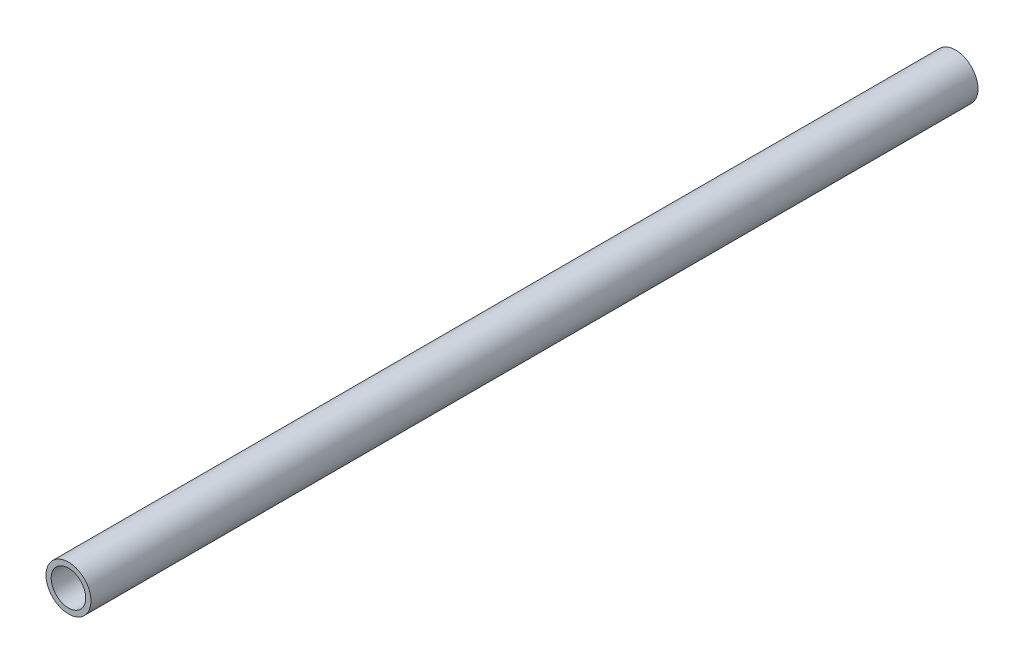
ISO-10303-21;
HEADER;
FILE_DESCRIPTION(('STEP AP214'),'2;1');
FILE_NAME('part.step','',(''),(''),'','','');
FILE_SCHEMA(('AUTOMOTIVE_DESIGN { 1 0 10303 214 1 1 1 1 }'));
ENDSEC;
DATA;
#1=APPLICATION_CONTEXT('core data for automotive mechanical design processes');
#2=APPLICATION_PROTOCOL_DEFINITION('international standard','automotive_design',2000,#1);
#3=PRODUCT_CONTEXT('',#1,'mechanical');
#4=PRODUCT('Part','Part','',(#3));
#5=PRODUCT_RELATED_PRODUCT_CATEGORY('part','',(#4));
#6=PRODUCT_DEFINITION_FORMATION('','',#4);
#7=PRODUCT_DEFINITION_CONTEXT('part definition',#1,'design');
#8=PRODUCT_DEFINITION('design','',#6,#7);
#9=PRODUCT_DEFINITION_SHAPE('','',#8);
#10=(LENGTH_UNIT() NAMED_UNIT(*) SI_UNIT(.MILLI.,.METRE.));
#11=(NAMED_UNIT(*) PLANE_ANGLE_UNIT() SI_UNIT($,.RADIAN.));
#12=(NAMED_UNIT(*) SI_UNIT($,.STERADIAN.) SOLID_ANGLE_UNIT());
#13=UNCERTAINTY_MEASURE_WITH_UNIT(LENGTH_MEASURE(1.E-05),#10,'distance_accuracy_value','');
#14=(GEOMETRIC_REPRESENTATION_CONTEXT(3) GLOBAL_UNCERTAINTY_ASSIGNED_CONTEXT((#13)) GLOBAL_UNIT_ASSIGNED_CONTEXT((#10,
#11,#12)) REPRESENTATION_CONTEXT('',''));
#15=CARTESIAN_POINT('',(0.,0.,0.));
#16=DIRECTION('',(0.,0.,1.));
#17=DIRECTION('',(1.,0.,0.));
#18=AXIS2_PLACEMENT_3D('',#15,#16,#17);
#19=CARTESIAN_POINT('',(0.,0.,0.));
#20=DIRECTION('',(0.,0.,1.));
#21=DIRECTION('',(1.,0.,0.));
#22=AXIS2_PLACEMENT_3D('',#19,#20,#21);
#23=PLANE('',#22);
#24=CARTESIAN_POINT('',(0.,0.,0.));
#25=DIRECTION('',(0.,0.,1.));
#26=DIRECTION('',(1.,0.,0.));
#27=AXIS2_PLACEMENT_3D('',#24,#25,#26);
#28=CIRCLE('',#27,6.35);
#29=CARTESIAN_POINT('',(6.35,0.,0.));
#30=VERTEX_POINT('',#29);
#31=EDGE_CURVE('E38',#30,#30,#28,.T.);
#32=ORIENTED_EDGE('',*,*,#31,.F.);
#33=EDGE_LOOP('',(#32));
#34=FACE_BOUND('',#33,.T.);
#35=CARTESIAN_POINT('',(0.,0.,0.));
#36=DIRECTION('',(0.,0.,1.));
#37=DIRECTION('',(1.,0.,0.));
#38=AXIS2_PLACEMENT_3D('',#35,#36,#37);
#39=CIRCLE('',#38,4.8768);
#40=CARTESIAN_POINT('',(4.8768,0.,0.));
#41=VERTEX_POINT('',#40);
#42=EDGE_CURVE('E51',#41,#41,#39,.T.);
#43=ORIENTED_EDGE('',*,*,#42,.T.);
#44=EDGE_LOOP('',(#43));
#45=FACE_BOUND('',#44,.T.);
#46=ADVANCED_FACE('F34',(#34,#45),#23,.F.);
#47=CARTESIAN_POINT('',(0.,0.,268.450232242138));
#48=DIRECTION('',(0.,0.,-1.));
#49=DIRECTION('',(-1.,0.,0.));
#50=AXIS2_PLACEMENT_3D('',#47,#48,#49);
#51=CYLINDRICAL_SURFACE('',#50,6.35);
#52=CARTESIAN_POINT('',(0.,0.,250.48972));
#53=DIRECTION('',(0.,0.,-1.));
#54=DIRECTION('',(-0.981498676058551,-0.19146892409817,0.));
#55=AXIS2_PLACEMENT_3D('',#52,#53,#54);
#56=CIRCLE('',#55,6.35);
#57=CARTESIAN_POINT('',(-6.23251659297183,-1.21582766802342,250.48972));
#58=VERTEX_POINT('',#57);
#59=EDGE_CURVE('E10',#58,#58,#56,.T.);
#60=ORIENTED_EDGE('',*,*,#59,.T.);
#61=EDGE_LOOP('',(#60));
#62=FACE_BOUND('',#61,.T.);
#63=ORIENTED_EDGE('',*,*,#31,.T.);
#64=EDGE_LOOP('',(#63));
#65=FACE_BOUND('',#64,.T.);
#66=ADVANCED_FACE('F36',(#62,#65),#51,.T.);
#67=CARTESIAN_POINT('',(0.,0.,268.450232242138));
#68=DIRECTION('',(0.,0.,-1.));
#69=DIRECTION('',(-1.,0.,0.));
#70=AXIS2_PLACEMENT_3D('',#67,#68,#69);
#71=CYLINDRICAL_SURFACE('',#70,4.8768);
#72=CARTESIAN_POINT('',(0.,0.,250.48972));
#73=DIRECTION('',(0.,0.,-1.));
#74=DIRECTION('',(-0.981498676058551,-0.19146892409817,0.));
#75=AXIS2_PLACEMENT_3D('',#72,#73,#74);
#76=CIRCLE('',#75,4.8768);
#77=CARTESIAN_POINT('',(-4.78657274340237,-0.933755649041999,250.48972));
#78=VERTEX_POINT('',#77);
#79=EDGE_CURVE('E43',#78,#78,#76,.T.);
#80=ORIENTED_EDGE('',*,*,#79,.F.);
#81=EDGE_LOOP('',(#80));
#82=FACE_BOUND('',#81,.T.);
#83=ORIENTED_EDGE('',*,*,#42,.F.);
#84=EDGE_LOOP('',(#83));
#85=FACE_BOUND('',#84,.T.);
#86=ADVANCED_FACE('F67',(#82,#85),#71,.F.);
#87=CARTESIAN_POINT('',(0.,0.,250.48972));
#88=DIRECTION('',(0.,0.,-1.));
#89=DIRECTION('',(-0.981498676058551,-0.19146892409817,0.));
#90=AXIS2_PLACEMENT_3D('',#87,#88,#89);
#91=PLANE('',#90);
#92=ORIENTED_EDGE('',*,*,#79,.T.);
#93=EDGE_LOOP('',(#92));
#94=FACE_BOUND('',#93,.T.);
#95=ORIENTED_EDGE('',*,*,#59,.F.);
#96=EDGE_LOOP('',(#95));
#97=FACE_BOUND('',#96,.T.);
#98=ADVANCED_FACE('F71',(#94,#97),#91,.F.);
#99=CLOSED_SHELL('',(#46,#66,#86,#98));
#100=MANIFOLD_SOLID_BREP('B2',#99);
#101=ADVANCED_BREP_SHAPE_REPRESENTATION('',(#18,#100),#14);
#102=SHAPE_DEFINITION_REPRESENTATION(#9,#101);
ENDSEC;
END-ISO-10303-21;
